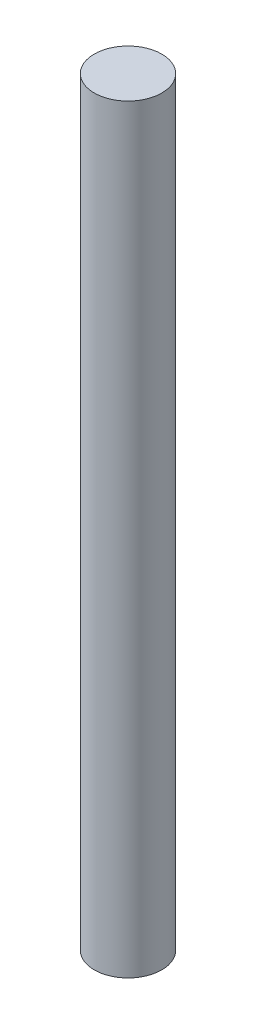
ISO-10303-21;
HEADER;
FILE_DESCRIPTION(('STEP AP214'),'2;1');
FILE_NAME('part.step','',(''),(''),'','','');
FILE_SCHEMA(('AUTOMOTIVE_DESIGN { 1 0 10303 214 1 1 1 1 }'));
ENDSEC;
DATA;
#1=APPLICATION_CONTEXT('core data for automotive mechanical design processes');
#2=APPLICATION_PROTOCOL_DEFINITION('international standard','automotive_design',2000,#1);
#3=PRODUCT_CONTEXT('',#1,'mechanical');
#4=PRODUCT('Part','Part','',(#3));
#5=PRODUCT_RELATED_PRODUCT_CATEGORY('part','',(#4));
#6=PRODUCT_DEFINITION_FORMATION('','',#4);
#7=PRODUCT_DEFINITION_CONTEXT('part definition',#1,'design');
#8=PRODUCT_DEFINITION('design','',#6,#7);
#9=PRODUCT_DEFINITION_SHAPE('','',#8);
#10=(LENGTH_UNIT() NAMED_UNIT(*) SI_UNIT(.MILLI.,.METRE.));
#11=(NAMED_UNIT(*) PLANE_ANGLE_UNIT() SI_UNIT($,.RADIAN.));
#12=(NAMED_UNIT(*) SI_UNIT($,.STERADIAN.) SOLID_ANGLE_UNIT());
#13=UNCERTAINTY_MEASURE_WITH_UNIT(LENGTH_MEASURE(1.E-05),#10,'distance_accuracy_value','');
#14=(GEOMETRIC_REPRESENTATION_CONTEXT(3) GLOBAL_UNCERTAINTY_ASSIGNED_CONTEXT((#13)) GLOBAL_UNIT_ASSIGNED_CONTEXT((#10,
#11,#12)) REPRESENTATION_CONTEXT('',''));
#15=CARTESIAN_POINT('',(0.,0.,0.));
#16=DIRECTION('',(0.,0.,1.));
#17=DIRECTION('',(1.,0.,0.));
#18=AXIS2_PLACEMENT_3D('',#15,#16,#17);
#19=CARTESIAN_POINT('',(0.,45.,0.));
#20=DIRECTION('',(0.,-1.,0.));
#21=DIRECTION('',(0.,0.,-1.));
#22=AXIS2_PLACEMENT_3D('',#19,#20,#21);
#23=CYLINDRICAL_SURFACE('',#22,2.);
#24=CARTESIAN_POINT('',(0.,45.,0.));
#25=DIRECTION('',(0.,1.,0.));
#26=DIRECTION('',(0.,0.,1.));
#27=AXIS2_PLACEMENT_3D('',#24,#25,#26);
#28=CIRCLE('',#27,2.);
#29=CARTESIAN_POINT('',(0.,45.,-2.));
#30=VERTEX_POINT('',#29);
#31=EDGE_CURVE('E10',#30,#30,#28,.T.);
#32=CARTESIAN_POINT('',(0.,0.,0.));
#33=DIRECTION('',(0.,1.,0.));
#34=DIRECTION('',(0.,0.,1.));
#35=AXIS2_PLACEMENT_3D('',#32,#33,#34);
#36=CIRCLE('',#35,2.);
#37=CARTESIAN_POINT('',(0.,0.,-2.));
#38=VERTEX_POINT('',#37);
#39=EDGE_CURVE('E38',#38,#38,#36,.T.);
#40=CARTESIAN_POINT('',(0.,45.,-2.));
#41=CARTESIAN_POINT('',(0.,44.53125,-2.));
#42=CARTESIAN_POINT('',(0.,44.0625,-2.));
#43=CARTESIAN_POINT('',(0.,43.125,-2.));
#44=CARTESIAN_POINT('',(0.,42.65625,-2.));
#45=CARTESIAN_POINT('',(0.,41.71875,-2.));
#46=CARTESIAN_POINT('',(0.,41.25,-2.));
#47=CARTESIAN_POINT('',(0.,40.3125,-2.));
#48=CARTESIAN_POINT('',(0.,39.84375,-2.));
#49=CARTESIAN_POINT('',(0.,38.90625,-2.));
#50=CARTESIAN_POINT('',(0.,38.4375,-2.));
#51=CARTESIAN_POINT('',(0.,37.5,-2.));
#52=CARTESIAN_POINT('',(0.,37.03125,-2.));
#53=CARTESIAN_POINT('',(0.,36.09375,-2.));
#54=CARTESIAN_POINT('',(0.,35.625,-2.));
#55=CARTESIAN_POINT('',(0.,34.6875,-2.));
#56=CARTESIAN_POINT('',(0.,34.21875,-2.));
#57=CARTESIAN_POINT('',(0.,33.28125,-2.));
#58=CARTESIAN_POINT('',(0.,32.8125,-2.));
#59=CARTESIAN_POINT('',(0.,31.875,-2.));
#60=CARTESIAN_POINT('',(0.,31.40625,-2.));
#61=CARTESIAN_POINT('',(0.,30.46875,-2.));
#62=CARTESIAN_POINT('',(0.,30.,-2.));
#63=CARTESIAN_POINT('',(0.,29.0625,-2.));
#64=CARTESIAN_POINT('',(0.,28.59375,-2.));
#65=CARTESIAN_POINT('',(0.,27.65625,-2.));
#66=CARTESIAN_POINT('',(0.,27.1875,-2.));
#67=CARTESIAN_POINT('',(0.,26.25,-2.));
#68=CARTESIAN_POINT('',(0.,25.78125,-2.));
#69=CARTESIAN_POINT('',(0.,24.84375,-2.));
#70=CARTESIAN_POINT('',(0.,24.375,-2.));
#71=CARTESIAN_POINT('',(0.,23.4375,-2.));
#72=CARTESIAN_POINT('',(0.,22.96875,-2.));
#73=CARTESIAN_POINT('',(0.,22.03125,-2.));
#74=CARTESIAN_POINT('',(0.,21.5625,-2.));
#75=CARTESIAN_POINT('',(0.,20.625,-2.));
#76=CARTESIAN_POINT('',(0.,20.15625,-2.));
#77=CARTESIAN_POINT('',(0.,19.21875,-2.));
#78=CARTESIAN_POINT('',(0.,18.75,-2.));
#79=CARTESIAN_POINT('',(0.,17.8125,-2.));
#80=CARTESIAN_POINT('',(0.,17.34375,-2.));
#81=CARTESIAN_POINT('',(0.,16.40625,-2.));
#82=CARTESIAN_POINT('',(0.,15.9375,-2.));
#83=CARTESIAN_POINT('',(0.,15.,-2.));
#84=CARTESIAN_POINT('',(0.,14.53125,-2.));
#85=CARTESIAN_POINT('',(0.,13.59375,-2.));
#86=CARTESIAN_POINT('',(0.,13.125,-2.));
#87=CARTESIAN_POINT('',(0.,12.1875,-2.));
#88=CARTESIAN_POINT('',(0.,11.71875,-2.));
#89=CARTESIAN_POINT('',(0.,10.78125,-2.));
#90=CARTESIAN_POINT('',(0.,10.3125,-2.));
#91=CARTESIAN_POINT('',(0.,9.37499999999999,-2.));
#92=CARTESIAN_POINT('',(0.,8.90624999999999,-2.));
#93=CARTESIAN_POINT('',(0.,7.96874999999999,-2.));
#94=CARTESIAN_POINT('',(0.,7.5,-2.));
#95=CARTESIAN_POINT('',(0.,6.56249999999999,-2.));
#96=CARTESIAN_POINT('',(0.,6.09374999999999,-2.));
#97=CARTESIAN_POINT('',(0.,5.15624999999999,-2.));
#98=CARTESIAN_POINT('',(0.,4.68749999999999,-2.));
#99=CARTESIAN_POINT('',(0.,3.74999999999999,-2.));
#100=CARTESIAN_POINT('',(0.,3.28124999999999,-2.));
#101=CARTESIAN_POINT('',(0.,2.34374999999999,-2.));
#102=CARTESIAN_POINT('',(0.,1.87499999999999,-2.));
#103=CARTESIAN_POINT('',(0.,0.937499999999992,-2.));
#104=CARTESIAN_POINT('',(0.,0.468749999999993,-2.));
#105=CARTESIAN_POINT('',(0.,0.,-2.));
#106=B_SPLINE_CURVE_WITH_KNOTS('',3,(#40,#41,#42,#43,#44,#45,#46,#47,#48,#49,#50,#51,#52,#53,
#54,#55,#56,#57,#58,#59,#60,#61,#62,#63,#64,#65,#66,#67,#68,#69,#70,#71,#72,#73,#74,#75,#76,#77,
#78,#79,#80,#81,#82,#83,#84,#85,#86,#87,#88,#89,#90,#91,#92,#93,#94,#95,#96,#97,#98,#99,#100,
#101,#102,#103,#104,#105),.UNSPECIFIED.,.F.,.F.,(4,2,2,2,2,2,2,2,2,2,2,2,2,2,2,2,2,2,2,2,2,2,2,
2,2,2,2,2,2,2,2,2,4),(0.,1.40625,2.8125,4.21874999999999,5.625,7.03125,8.43749999999999,9.84375,
11.25,12.65625,14.0625,15.46875,16.875,18.28125,19.6875,21.09375,22.5,23.90625,25.3125,26.71875,
28.125,29.53125,30.9375,32.34375,33.75,35.15625,36.5625,37.96875,39.375,40.78125,42.1875,
43.59375,45.),.UNSPECIFIED.);
#107=EDGE_CURVE('BSEAM35',#30,#38,#106,.T.);
#108=ORIENTED_EDGE('',*,*,#31,.F.);
#109=ORIENTED_EDGE('',*,*,#39,.T.);
#110=ORIENTED_EDGE('',*,*,#107,.T.);
#111=ORIENTED_EDGE('',*,*,#107,.F.);
#112=EDGE_LOOP('',(#108,#110,#109,#111));
#113=FACE_BOUND('',#112,.T.);
#114=ADVANCED_FACE('F35',(#113),#23,.T.);
#115=CARTESIAN_POINT('',(0.,45.,0.));
#116=DIRECTION('',(0.,1.,0.));
#117=DIRECTION('',(0.,0.,1.));
#118=AXIS2_PLACEMENT_3D('',#115,#116,#117);
#119=PLANE('',#118);
#120=ORIENTED_EDGE('',*,*,#31,.T.);
#121=EDGE_LOOP('',(#120));
#122=FACE_BOUND('',#121,.T.);
#123=ADVANCED_FACE('F50',(#122),#119,.T.);
#124=CARTESIAN_POINT('',(0.,0.,0.));
#125=DIRECTION('',(0.,1.,0.));
#126=DIRECTION('',(0.,0.,1.));
#127=AXIS2_PLACEMENT_3D('',#124,#125,#126);
#128=PLANE('',#127);
#129=ORIENTED_EDGE('',*,*,#39,.F.);
#130=EDGE_LOOP('',(#129));
#131=FACE_BOUND('',#130,.T.);
#132=ADVANCED_FACE('F48',(#131),#128,.F.);
#133=CLOSED_SHELL('',(#114,#123,#132));
#134=MANIFOLD_SOLID_BREP('B2',#133);
#135=ADVANCED_BREP_SHAPE_REPRESENTATION('',(#18,#134),#14);
#136=SHAPE_DEFINITION_REPRESENTATION(#9,#135);
ENDSEC;
END-ISO-10303-21;
